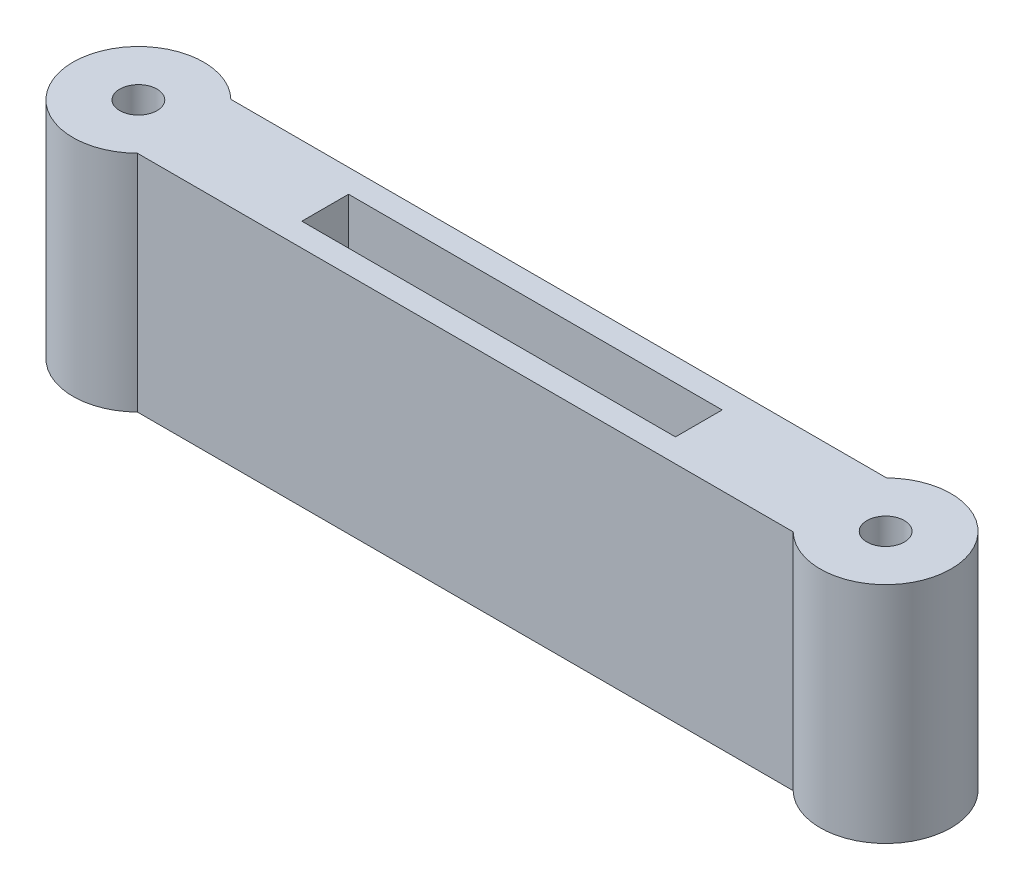
ISO-10303-21;
HEADER;
FILE_DESCRIPTION(('STEP AP214'),'2;1');
FILE_NAME('part.step','',(''),(''),'','','');
FILE_SCHEMA(('AUTOMOTIVE_DESIGN { 1 0 10303 214 1 1 1 1 }'));
ENDSEC;
DATA;
#1=APPLICATION_CONTEXT('core data for automotive mechanical design processes');
#2=APPLICATION_PROTOCOL_DEFINITION('international standard','automotive_design',2000,#1);
#3=PRODUCT_CONTEXT('',#1,'mechanical');
#4=PRODUCT('Part','Part','',(#3));
#5=PRODUCT_RELATED_PRODUCT_CATEGORY('part','',(#4));
#6=PRODUCT_DEFINITION_FORMATION('','',#4);
#7=PRODUCT_DEFINITION_CONTEXT('part definition',#1,'design');
#8=PRODUCT_DEFINITION('design','',#6,#7);
#9=PRODUCT_DEFINITION_SHAPE('','',#8);
#10=(LENGTH_UNIT() NAMED_UNIT(*) SI_UNIT(.MILLI.,.METRE.));
#11=(NAMED_UNIT(*) PLANE_ANGLE_UNIT() SI_UNIT($,.RADIAN.));
#12=(NAMED_UNIT(*) SI_UNIT($,.STERADIAN.) SOLID_ANGLE_UNIT());
#13=UNCERTAINTY_MEASURE_WITH_UNIT(LENGTH_MEASURE(1.E-05),#10,'distance_accuracy_value','');
#14=(GEOMETRIC_REPRESENTATION_CONTEXT(3) GLOBAL_UNCERTAINTY_ASSIGNED_CONTEXT((#13)) GLOBAL_UNIT_ASSIGNED_CONTEXT((#10,
#11,#12)) REPRESENTATION_CONTEXT('',''));
#15=CARTESIAN_POINT('',(0.,0.,0.));
#16=DIRECTION('',(0.,0.,1.));
#17=DIRECTION('',(1.,0.,0.));
#18=AXIS2_PLACEMENT_3D('',#15,#16,#17);
#19=CARTESIAN_POINT('',(0.,-60.,25.));
#20=DIRECTION('',(0.,0.,1.));
#21=DIRECTION('',(1.,0.,0.));
#22=AXIS2_PLACEMENT_3D('',#19,#20,#21);
#23=PLANE('',#22);
#24=DIRECTION('',(0.,1.,0.));
#25=VECTOR('',#24,1.);
#26=CARTESIAN_POINT('',(24.4948974278318,-60.,25.));
#27=LINE('',#26,#25);
#28=CARTESIAN_POINT('',(24.4948974278318,-60.,25.));
#29=VERTEX_POINT('',#28);
#30=CARTESIAN_POINT('',(24.4948974278318,60.,25.));
#31=VERTEX_POINT('',#30);
#32=EDGE_CURVE('E174',#29,#31,#27,.T.);
#33=ORIENTED_EDGE('',*,*,#32,.F.);
#34=DIRECTION('',(1.,0.,0.));
#35=VECTOR('',#34,1.);
#36=CARTESIAN_POINT('',(0.,-60.,25.));
#37=LINE('',#36,#35);
#38=CARTESIAN_POINT('',(375.505102572168,-60.,25.));
#39=VERTEX_POINT('',#38);
#40=EDGE_CURVE('E11',#29,#39,#37,.T.);
#41=ORIENTED_EDGE('',*,*,#40,.T.);
#42=DIRECTION('',(0.,1.,0.));
#43=VECTOR('',#42,1.);
#44=CARTESIAN_POINT('',(375.505102572168,-60.,25.));
#45=LINE('',#44,#43);
#46=CARTESIAN_POINT('',(375.505102572168,60.,25.));
#47=VERTEX_POINT('',#46);
#48=EDGE_CURVE('E167',#47,#39,#45,.F.);
#49=ORIENTED_EDGE('',*,*,#48,.F.);
#50=DIRECTION('',(1.,0.,0.));
#51=VECTOR('',#50,1.);
#52=CARTESIAN_POINT('',(0.,60.,25.));
#53=LINE('',#52,#51);
#54=EDGE_CURVE('E176',#31,#47,#53,.T.);
#55=ORIENTED_EDGE('',*,*,#54,.F.);
#56=EDGE_LOOP('',(#33,#41,#49,#55));
#57=FACE_BOUND('',#56,.T.);
#58=ADVANCED_FACE('F39',(#57),#23,.T.);
#59=CARTESIAN_POINT('',(0.,-60.,-25.));
#60=DIRECTION('',(0.,0.,-1.));
#61=DIRECTION('',(-1.,0.,0.));
#62=AXIS2_PLACEMENT_3D('',#59,#60,#61);
#63=PLANE('',#62);
#64=DIRECTION('',(0.,1.,0.));
#65=VECTOR('',#64,1.);
#66=CARTESIAN_POINT('',(24.4948974278318,-60.,-25.));
#67=LINE('',#66,#65);
#68=CARTESIAN_POINT('',(24.4948974278318,60.,-25.));
#69=VERTEX_POINT('',#68);
#70=CARTESIAN_POINT('',(24.4948974278318,-60.,-25.));
#71=VERTEX_POINT('',#70);
#72=EDGE_CURVE('E166',#69,#71,#67,.F.);
#73=ORIENTED_EDGE('',*,*,#72,.F.);
#74=DIRECTION('',(-1.,0.,0.));
#75=VECTOR('',#74,1.);
#76=CARTESIAN_POINT('',(0.,60.,-25.));
#77=LINE('',#76,#75);
#78=CARTESIAN_POINT('',(375.505102572168,60.,-25.));
#79=VERTEX_POINT('',#78);
#80=EDGE_CURVE('E171',#79,#69,#77,.T.);
#81=ORIENTED_EDGE('',*,*,#80,.F.);
#82=DIRECTION('',(0.,1.,0.));
#83=VECTOR('',#82,1.);
#84=CARTESIAN_POINT('',(375.505102572168,-60.,-25.));
#85=LINE('',#84,#83);
#86=CARTESIAN_POINT('',(375.505102572168,-60.,-25.));
#87=VERTEX_POINT('',#86);
#88=EDGE_CURVE('E157',#87,#79,#85,.T.);
#89=ORIENTED_EDGE('',*,*,#88,.F.);
#90=DIRECTION('',(-1.,0.,0.));
#91=VECTOR('',#90,1.);
#92=CARTESIAN_POINT('',(0.,-60.,-25.));
#93=LINE('',#92,#91);
#94=EDGE_CURVE('E50',#87,#71,#93,.T.);
#95=ORIENTED_EDGE('',*,*,#94,.T.);
#96=EDGE_LOOP('',(#73,#81,#89,#95));
#97=FACE_BOUND('',#96,.T.);
#98=ADVANCED_FACE('F41',(#97),#63,.T.);
#99=CARTESIAN_POINT('',(0.,-60.,0.));
#100=DIRECTION('',(0.,-1.,0.));
#101=DIRECTION('',(0.,0.,-1.));
#102=AXIS2_PLACEMENT_3D('',#99,#100,#101);
#103=PLANE('',#102);
#104=DIRECTION('',(0.,0.,-1.));
#105=VECTOR('',#104,1.);
#106=CARTESIAN_POINT('',(300.,-60.,12.5));
#107=LINE('',#106,#105);
#108=CARTESIAN_POINT('',(300.,-60.,12.5));
#109=VERTEX_POINT('',#108);
#110=CARTESIAN_POINT('',(300.,-60.,-12.5));
#111=VERTEX_POINT('',#110);
#112=EDGE_CURVE('E121',#109,#111,#107,.T.);
#113=ORIENTED_EDGE('',*,*,#112,.T.);
#114=DIRECTION('',(-1.,0.,0.));
#115=VECTOR('',#114,1.);
#116=CARTESIAN_POINT('',(100.,-60.,-12.5));
#117=LINE('',#116,#115);
#118=CARTESIAN_POINT('',(100.,-60.,-12.5));
#119=VERTEX_POINT('',#118);
#120=EDGE_CURVE('E129',#111,#119,#117,.T.);
#121=ORIENTED_EDGE('',*,*,#120,.T.);
#122=DIRECTION('',(0.,0.,1.));
#123=VECTOR('',#122,1.);
#124=CARTESIAN_POINT('',(100.,-60.,12.5));
#125=LINE('',#124,#123);
#126=CARTESIAN_POINT('',(100.,-60.,12.5));
#127=VERTEX_POINT('',#126);
#128=EDGE_CURVE('E53',#119,#127,#125,.T.);
#129=ORIENTED_EDGE('',*,*,#128,.T.);
#130=DIRECTION('',(1.,0.,0.));
#131=VECTOR('',#130,1.);
#132=CARTESIAN_POINT('',(100.,-60.,12.5));
#133=LINE('',#132,#131);
#134=EDGE_CURVE('E134',#127,#109,#133,.T.);
#135=ORIENTED_EDGE('',*,*,#134,.T.);
#136=EDGE_LOOP('',(#113,#121,#129,#135));
#137=FACE_BOUND('',#136,.T.);
#138=CARTESIAN_POINT('',(0.,-60.,0.));
#139=DIRECTION('',(0.,1.,0.));
#140=DIRECTION('',(0.,0.,1.));
#141=AXIS2_PLACEMENT_3D('',#138,#139,#140);
#142=CIRCLE('',#141,10.);
#143=CARTESIAN_POINT('',(0.,-60.,10.));
#144=VERTEX_POINT('',#143);
#145=EDGE_CURVE('E141',#144,#144,#142,.T.);
#146=ORIENTED_EDGE('',*,*,#145,.T.);
#147=EDGE_LOOP('',(#146));
#148=FACE_BOUND('',#147,.T.);
#149=CARTESIAN_POINT('',(400.,-60.,0.));
#150=DIRECTION('',(0.,1.,0.));
#151=DIRECTION('',(0.,0.,1.));
#152=AXIS2_PLACEMENT_3D('',#149,#150,#151);
#153=CIRCLE('',#152,9.99999999999998);
#154=CARTESIAN_POINT('',(400.,-60.,9.99999999999998));
#155=VERTEX_POINT('',#154);
#156=EDGE_CURVE('E140',#155,#155,#153,.T.);
#157=ORIENTED_EDGE('',*,*,#156,.T.);
#158=EDGE_LOOP('',(#157));
#159=FACE_BOUND('',#158,.T.);
#160=ORIENTED_EDGE('',*,*,#40,.F.);
#161=CARTESIAN_POINT('',(0.,-60.,0.));
#162=DIRECTION('',(0.,1.,0.));
#163=DIRECTION('',(0.,0.,1.));
#164=AXIS2_PLACEMENT_3D('',#161,#162,#163);
#165=CIRCLE('',#164,35.);
#166=EDGE_CURVE('E154',#71,#29,#165,.T.);
#167=ORIENTED_EDGE('',*,*,#166,.F.);
#168=ORIENTED_EDGE('',*,*,#94,.F.);
#169=CARTESIAN_POINT('',(400.,-60.,0.));
#170=DIRECTION('',(0.,1.,0.));
#171=DIRECTION('',(0.,0.,1.));
#172=AXIS2_PLACEMENT_3D('',#169,#170,#171);
#173=CIRCLE('',#172,35.);
#174=EDGE_CURVE('E150',#39,#87,#173,.T.);
#175=ORIENTED_EDGE('',*,*,#174,.F.);
#176=EDGE_LOOP('',(#160,#167,#168,#175));
#177=FACE_BOUND('',#176,.T.);
#178=ADVANCED_FACE('F190',(#137,#148,#159,#177),#103,.T.);
#179=CARTESIAN_POINT('',(0.,60.,0.));
#180=DIRECTION('',(0.,-1.,0.));
#181=DIRECTION('',(0.,0.,-1.));
#182=AXIS2_PLACEMENT_3D('',#179,#180,#181);
#183=PLANE('',#182);
#184=DIRECTION('',(-1.,0.,0.));
#185=VECTOR('',#184,1.);
#186=CARTESIAN_POINT('',(100.,60.,-12.5));
#187=LINE('',#186,#185);
#188=CARTESIAN_POINT('',(300.,60.,-12.5));
#189=VERTEX_POINT('',#188);
#190=CARTESIAN_POINT('',(100.,60.,-12.5));
#191=VERTEX_POINT('',#190);
#192=EDGE_CURVE('E111',#189,#191,#187,.T.);
#193=ORIENTED_EDGE('',*,*,#192,.F.);
#194=DIRECTION('',(0.,0.,-1.));
#195=VECTOR('',#194,1.);
#196=CARTESIAN_POINT('',(300.,60.,12.5));
#197=LINE('',#196,#195);
#198=CARTESIAN_POINT('',(300.,60.,12.5));
#199=VERTEX_POINT('',#198);
#200=EDGE_CURVE('E64',#199,#189,#197,.T.);
#201=ORIENTED_EDGE('',*,*,#200,.F.);
#202=DIRECTION('',(1.,0.,0.));
#203=VECTOR('',#202,1.);
#204=CARTESIAN_POINT('',(100.,60.,12.5));
#205=LINE('',#204,#203);
#206=CARTESIAN_POINT('',(100.,60.,12.5));
#207=VERTEX_POINT('',#206);
#208=EDGE_CURVE('E123',#207,#199,#205,.T.);
#209=ORIENTED_EDGE('',*,*,#208,.F.);
#210=DIRECTION('',(0.,0.,1.));
#211=VECTOR('',#210,1.);
#212=CARTESIAN_POINT('',(100.,60.,12.5));
#213=LINE('',#212,#211);
#214=EDGE_CURVE('E104',#191,#207,#213,.T.);
#215=ORIENTED_EDGE('',*,*,#214,.F.);
#216=EDGE_LOOP('',(#193,#201,#209,#215));
#217=FACE_BOUND('',#216,.T.);
#218=CARTESIAN_POINT('',(0.,60.,0.));
#219=DIRECTION('',(0.,1.,0.));
#220=DIRECTION('',(0.,0.,1.));
#221=AXIS2_PLACEMENT_3D('',#218,#219,#220);
#222=CIRCLE('',#221,10.);
#223=CARTESIAN_POINT('',(0.,60.,10.));
#224=VERTEX_POINT('',#223);
#225=EDGE_CURVE('E139',#224,#224,#222,.T.);
#226=ORIENTED_EDGE('',*,*,#225,.F.);
#227=EDGE_LOOP('',(#226));
#228=FACE_BOUND('',#227,.T.);
#229=CARTESIAN_POINT('',(400.,60.,0.));
#230=DIRECTION('',(0.,1.,0.));
#231=DIRECTION('',(0.,0.,1.));
#232=AXIS2_PLACEMENT_3D('',#229,#230,#231);
#233=CIRCLE('',#232,9.99999999999998);
#234=CARTESIAN_POINT('',(400.,60.,9.99999999999998));
#235=VERTEX_POINT('',#234);
#236=EDGE_CURVE('E145',#235,#235,#233,.T.);
#237=ORIENTED_EDGE('',*,*,#236,.F.);
#238=EDGE_LOOP('',(#237));
#239=FACE_BOUND('',#238,.T.);
#240=CARTESIAN_POINT('',(0.,60.,0.));
#241=DIRECTION('',(0.,1.,0.));
#242=DIRECTION('',(0.,0.,1.));
#243=AXIS2_PLACEMENT_3D('',#240,#241,#242);
#244=CIRCLE('',#243,35.);
#245=EDGE_CURVE('E155',#69,#31,#244,.T.);
#246=ORIENTED_EDGE('',*,*,#245,.T.);
#247=ORIENTED_EDGE('',*,*,#54,.T.);
#248=CARTESIAN_POINT('',(400.,60.,0.));
#249=DIRECTION('',(0.,1.,0.));
#250=DIRECTION('',(0.,0.,1.));
#251=AXIS2_PLACEMENT_3D('',#248,#249,#250);
#252=CIRCLE('',#251,35.);
#253=EDGE_CURVE('E156',#47,#79,#252,.T.);
#254=ORIENTED_EDGE('',*,*,#253,.T.);
#255=ORIENTED_EDGE('',*,*,#80,.T.);
#256=EDGE_LOOP('',(#246,#247,#254,#255));
#257=FACE_BOUND('',#256,.T.);
#258=ADVANCED_FACE('F117',(#217,#228,#239,#257),#183,.F.);
#259=CARTESIAN_POINT('',(400.,-60.,0.));
#260=DIRECTION('',(0.,1.,0.));
#261=DIRECTION('',(0.,0.,1.));
#262=AXIS2_PLACEMENT_3D('',#259,#260,#261);
#263=CYLINDRICAL_SURFACE('',#262,35.);
#264=ORIENTED_EDGE('',*,*,#253,.F.);
#265=ORIENTED_EDGE('',*,*,#48,.T.);
#266=ORIENTED_EDGE('',*,*,#174,.T.);
#267=ORIENTED_EDGE('',*,*,#88,.T.);
#268=EDGE_LOOP('',(#264,#265,#266,#267));
#269=FACE_BOUND('',#268,.T.);
#270=ADVANCED_FACE('F191',(#269),#263,.T.);
#271=CARTESIAN_POINT('',(0.,-60.,0.));
#272=DIRECTION('',(0.,1.,0.));
#273=DIRECTION('',(0.,0.,1.));
#274=AXIS2_PLACEMENT_3D('',#271,#272,#273);
#275=CYLINDRICAL_SURFACE('',#274,35.);
#276=ORIENTED_EDGE('',*,*,#166,.T.);
#277=ORIENTED_EDGE('',*,*,#32,.T.);
#278=ORIENTED_EDGE('',*,*,#245,.F.);
#279=ORIENTED_EDGE('',*,*,#72,.T.);
#280=EDGE_LOOP('',(#276,#277,#278,#279));
#281=FACE_BOUND('',#280,.T.);
#282=ADVANCED_FACE('F189',(#281),#275,.T.);
#283=CARTESIAN_POINT('',(400.,-60.,0.));
#284=DIRECTION('',(0.,1.,0.));
#285=DIRECTION('',(0.,0.,1.));
#286=AXIS2_PLACEMENT_3D('',#283,#284,#285);
#287=CYLINDRICAL_SURFACE('',#286,9.99999999999998);
#288=ORIENTED_EDGE('',*,*,#156,.F.);
#289=EDGE_LOOP('',(#288));
#290=FACE_BOUND('',#289,.T.);
#291=ORIENTED_EDGE('',*,*,#236,.T.);
#292=EDGE_LOOP('',(#291));
#293=FACE_BOUND('',#292,.T.);
#294=ADVANCED_FACE('F221',(#290,#293),#287,.F.);
#295=CARTESIAN_POINT('',(0.,-60.,0.));
#296=DIRECTION('',(0.,1.,0.));
#297=DIRECTION('',(0.,0.,1.));
#298=AXIS2_PLACEMENT_3D('',#295,#296,#297);
#299=CYLINDRICAL_SURFACE('',#298,10.);
#300=ORIENTED_EDGE('',*,*,#145,.F.);
#301=EDGE_LOOP('',(#300));
#302=FACE_BOUND('',#301,.T.);
#303=ORIENTED_EDGE('',*,*,#225,.T.);
#304=EDGE_LOOP('',(#303));
#305=FACE_BOUND('',#304,.T.);
#306=ADVANCED_FACE('F235',(#302,#305),#299,.F.);
#307=CARTESIAN_POINT('',(300.,-60.,12.5));
#308=DIRECTION('',(1.,0.,0.));
#309=DIRECTION('',(0.,0.,-1.));
#310=AXIS2_PLACEMENT_3D('',#307,#308,#309);
#311=PLANE('',#310);
#312=DIRECTION('',(0.,1.,0.));
#313=VECTOR('',#312,1.);
#314=CARTESIAN_POINT('',(300.,-60.,-12.5));
#315=LINE('',#314,#313);
#316=EDGE_CURVE('E112',#111,#189,#315,.T.);
#317=ORIENTED_EDGE('',*,*,#316,.F.);
#318=ORIENTED_EDGE('',*,*,#112,.F.);
#319=DIRECTION('',(0.,1.,0.));
#320=VECTOR('',#319,1.);
#321=CARTESIAN_POINT('',(300.,-60.,12.5));
#322=LINE('',#321,#320);
#323=EDGE_CURVE('E131',#109,#199,#322,.T.);
#324=ORIENTED_EDGE('',*,*,#323,.T.);
#325=ORIENTED_EDGE('',*,*,#200,.T.);
#326=EDGE_LOOP('',(#317,#318,#324,#325));
#327=FACE_BOUND('',#326,.T.);
#328=ADVANCED_FACE('F238',(#327),#311,.F.);
#329=CARTESIAN_POINT('',(100.,-60.,12.5));
#330=DIRECTION('',(0.,0.,1.));
#331=DIRECTION('',(1.,0.,0.));
#332=AXIS2_PLACEMENT_3D('',#329,#330,#331);
#333=PLANE('',#332);
#334=ORIENTED_EDGE('',*,*,#323,.F.);
#335=ORIENTED_EDGE('',*,*,#134,.F.);
#336=DIRECTION('',(0.,1.,0.));
#337=VECTOR('',#336,1.);
#338=CARTESIAN_POINT('',(100.,-60.,12.5));
#339=LINE('',#338,#337);
#340=EDGE_CURVE('E109',#127,#207,#339,.T.);
#341=ORIENTED_EDGE('',*,*,#340,.T.);
#342=ORIENTED_EDGE('',*,*,#208,.T.);
#343=EDGE_LOOP('',(#334,#335,#341,#342));
#344=FACE_BOUND('',#343,.T.);
#345=ADVANCED_FACE('F278',(#344),#333,.F.);
#346=CARTESIAN_POINT('',(100.,-60.,12.5));
#347=DIRECTION('',(-1.,0.,0.));
#348=DIRECTION('',(0.,0.,1.));
#349=AXIS2_PLACEMENT_3D('',#346,#347,#348);
#350=PLANE('',#349);
#351=ORIENTED_EDGE('',*,*,#340,.F.);
#352=ORIENTED_EDGE('',*,*,#128,.F.);
#353=DIRECTION('',(0.,1.,0.));
#354=VECTOR('',#353,1.);
#355=CARTESIAN_POINT('',(100.,-60.,-12.5));
#356=LINE('',#355,#354);
#357=EDGE_CURVE('E101',#119,#191,#356,.T.);
#358=ORIENTED_EDGE('',*,*,#357,.T.);
#359=ORIENTED_EDGE('',*,*,#214,.T.);
#360=EDGE_LOOP('',(#351,#352,#358,#359));
#361=FACE_BOUND('',#360,.T.);
#362=ADVANCED_FACE('F103',(#361),#350,.F.);
#363=CARTESIAN_POINT('',(100.,-60.,-12.5));
#364=DIRECTION('',(0.,0.,-1.));
#365=DIRECTION('',(-1.,0.,0.));
#366=AXIS2_PLACEMENT_3D('',#363,#364,#365);
#367=PLANE('',#366);
#368=ORIENTED_EDGE('',*,*,#357,.F.);
#369=ORIENTED_EDGE('',*,*,#120,.F.);
#370=ORIENTED_EDGE('',*,*,#316,.T.);
#371=ORIENTED_EDGE('',*,*,#192,.T.);
#372=EDGE_LOOP('',(#368,#369,#370,#371));
#373=FACE_BOUND('',#372,.T.);
#374=ADVANCED_FACE('F113',(#373),#367,.F.);
#375=CLOSED_SHELL('',(#58,#98,#178,#258,#270,#282,#294,#306,#328,#345,#362,#374));
#376=MANIFOLD_SOLID_BREP('B2',#375);
#377=ADVANCED_BREP_SHAPE_REPRESENTATION('',(#18,#376),#14);
#378=SHAPE_DEFINITION_REPRESENTATION(#9,#377);
ENDSEC;
END-ISO-10303-21;
